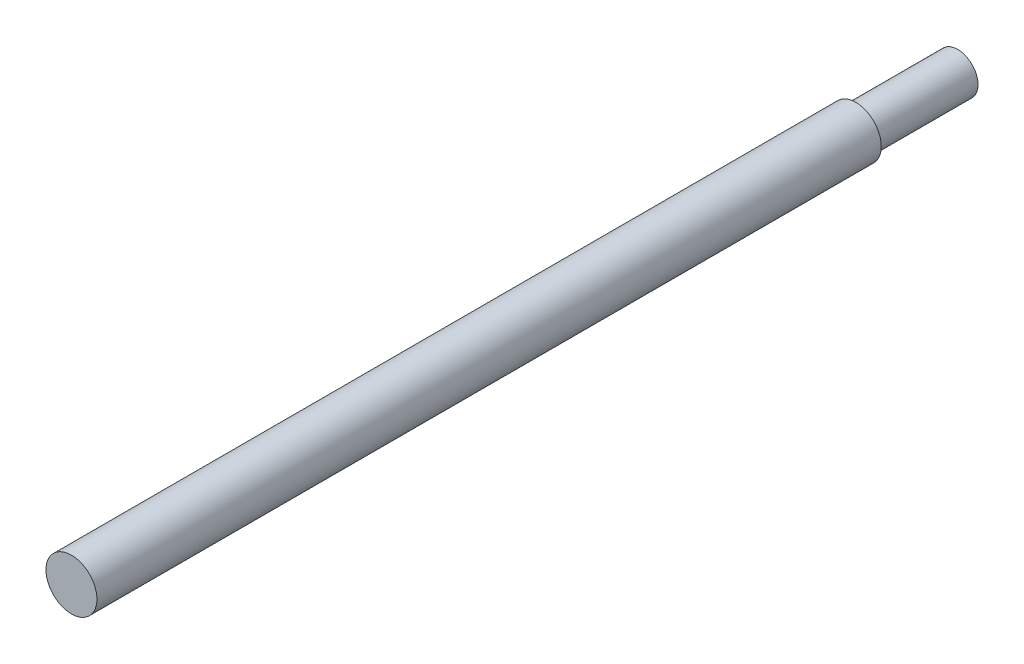
ISO-10303-21;
HEADER;
FILE_DESCRIPTION(('STEP AP214'),'2;1');
FILE_NAME('part.step','',(''),(''),'','','');
FILE_SCHEMA(('AUTOMOTIVE_DESIGN { 1 0 10303 214 1 1 1 1 }'));
ENDSEC;
DATA;
#1=APPLICATION_CONTEXT('core data for automotive mechanical design processes');
#2=APPLICATION_PROTOCOL_DEFINITION('international standard','automotive_design',2000,#1);
#3=PRODUCT_CONTEXT('',#1,'mechanical');
#4=PRODUCT('Part','Part','',(#3));
#5=PRODUCT_RELATED_PRODUCT_CATEGORY('part','',(#4));
#6=PRODUCT_DEFINITION_FORMATION('','',#4);
#7=PRODUCT_DEFINITION_CONTEXT('part definition',#1,'design');
#8=PRODUCT_DEFINITION('design','',#6,#7);
#9=PRODUCT_DEFINITION_SHAPE('','',#8);
#10=(LENGTH_UNIT() NAMED_UNIT(*) SI_UNIT(.MILLI.,.METRE.));
#11=(NAMED_UNIT(*) PLANE_ANGLE_UNIT() SI_UNIT($,.RADIAN.));
#12=(NAMED_UNIT(*) SI_UNIT($,.STERADIAN.) SOLID_ANGLE_UNIT());
#13=UNCERTAINTY_MEASURE_WITH_UNIT(LENGTH_MEASURE(1.E-05),#10,'distance_accuracy_value','');
#14=(GEOMETRIC_REPRESENTATION_CONTEXT(3) GLOBAL_UNCERTAINTY_ASSIGNED_CONTEXT((#13)) GLOBAL_UNIT_ASSIGNED_CONTEXT((#10,
#11,#12)) REPRESENTATION_CONTEXT('',''));
#15=CARTESIAN_POINT('',(0.,0.,0.));
#16=DIRECTION('',(0.,0.,1.));
#17=DIRECTION('',(1.,0.,0.));
#18=AXIS2_PLACEMENT_3D('',#15,#16,#17);
#19=CARTESIAN_POINT('',(0.,0.,87.));
#20=DIRECTION('',(0.,0.,-1.));
#21=DIRECTION('',(-1.,0.,0.));
#22=AXIS2_PLACEMENT_3D('',#19,#20,#21);
#23=CYLINDRICAL_SURFACE('',#22,2.5);
#24=CARTESIAN_POINT('',(0.,0.,10.));
#25=DIRECTION('',(0.,0.,-1.));
#26=DIRECTION('',(-1.,0.,0.));
#27=AXIS2_PLACEMENT_3D('',#24,#25,#26);
#28=CIRCLE('',#27,2.5);
#29=CARTESIAN_POINT('',(-2.5,0.,10.));
#30=VERTEX_POINT('',#29);
#31=EDGE_CURVE('E44',#30,#30,#28,.T.);
#32=ORIENTED_EDGE('',*,*,#31,.F.);
#33=EDGE_LOOP('',(#32));
#34=FACE_BOUND('',#33,.T.);
#35=CARTESIAN_POINT('',(0.,0.,87.));
#36=DIRECTION('',(0.,0.,1.));
#37=DIRECTION('',(1.,0.,0.));
#38=AXIS2_PLACEMENT_3D('',#35,#36,#37);
#39=CIRCLE('',#38,2.5);
#40=CARTESIAN_POINT('',(2.5,0.,87.));
#41=VERTEX_POINT('',#40);
#42=EDGE_CURVE('E10',#41,#41,#39,.T.);
#43=ORIENTED_EDGE('',*,*,#42,.F.);
#44=EDGE_LOOP('',(#43));
#45=FACE_BOUND('',#44,.T.);
#46=ADVANCED_FACE('F30',(#34,#45),#23,.T.);
#47=CARTESIAN_POINT('',(0.,0.,87.));
#48=DIRECTION('',(0.,0.,1.));
#49=DIRECTION('',(1.,0.,0.));
#50=AXIS2_PLACEMENT_3D('',#47,#48,#49);
#51=PLANE('',#50);
#52=ORIENTED_EDGE('',*,*,#42,.T.);
#53=EDGE_LOOP('',(#52));
#54=FACE_BOUND('',#53,.T.);
#55=ADVANCED_FACE('F54',(#54),#51,.T.);
#56=CARTESIAN_POINT('',(0.,0.,0.));
#57=DIRECTION('',(0.,0.,-1.));
#58=DIRECTION('',(-1.,0.,0.));
#59=AXIS2_PLACEMENT_3D('',#56,#57,#58);
#60=CYLINDRICAL_SURFACE('',#59,2.);
#61=CARTESIAN_POINT('',(0.,0.,0.));
#62=DIRECTION('',(0.,0.,-1.));
#63=DIRECTION('',(-1.,0.,0.));
#64=AXIS2_PLACEMENT_3D('',#61,#62,#63);
#65=CIRCLE('',#64,2.);
#66=CARTESIAN_POINT('',(-2.,0.,0.));
#67=VERTEX_POINT('',#66);
#68=EDGE_CURVE('E36',#67,#67,#65,.T.);
#69=ORIENTED_EDGE('',*,*,#68,.F.);
#70=EDGE_LOOP('',(#69));
#71=FACE_BOUND('',#70,.T.);
#72=CARTESIAN_POINT('',(0.,0.,10.));
#73=DIRECTION('',(0.,0.,-1.));
#74=DIRECTION('',(-1.,0.,0.));
#75=AXIS2_PLACEMENT_3D('',#72,#73,#74);
#76=CIRCLE('',#75,2.);
#77=CARTESIAN_POINT('',(-2.,0.,10.));
#78=VERTEX_POINT('',#77);
#79=EDGE_CURVE('E40',#78,#78,#76,.T.);
#80=ORIENTED_EDGE('',*,*,#79,.T.);
#81=EDGE_LOOP('',(#80));
#82=FACE_BOUND('',#81,.T.);
#83=ADVANCED_FACE('F58',(#71,#82),#60,.T.);
#84=CARTESIAN_POINT('',(0.,2.5,10.));
#85=DIRECTION('',(0.,0.,1.));
#86=DIRECTION('',(1.,0.,0.));
#87=AXIS2_PLACEMENT_3D('',#84,#85,#86);
#88=PLANE('',#87);
#89=ORIENTED_EDGE('',*,*,#79,.F.);
#90=EDGE_LOOP('',(#89));
#91=FACE_BOUND('',#90,.T.);
#92=ORIENTED_EDGE('',*,*,#31,.T.);
#93=EDGE_LOOP('',(#92));
#94=FACE_BOUND('',#93,.T.);
#95=ADVANCED_FACE('F50',(#91,#94),#88,.F.);
#96=CARTESIAN_POINT('',(0.,0.,0.));
#97=DIRECTION('',(0.,0.,1.));
#98=DIRECTION('',(1.,0.,0.));
#99=AXIS2_PLACEMENT_3D('',#96,#97,#98);
#100=PLANE('',#99);
#101=ORIENTED_EDGE('',*,*,#68,.T.);
#102=EDGE_LOOP('',(#101));
#103=FACE_BOUND('',#102,.T.);
#104=ADVANCED_FACE('F66',(#103),#100,.F.);
#105=CLOSED_SHELL('',(#46,#55,#83,#95,#104));
#106=MANIFOLD_SOLID_BREP('B2',#105);
#107=ADVANCED_BREP_SHAPE_REPRESENTATION('',(#18,#106),#14);
#108=SHAPE_DEFINITION_REPRESENTATION(#9,#107);
ENDSEC;
END-ISO-10303-21;
